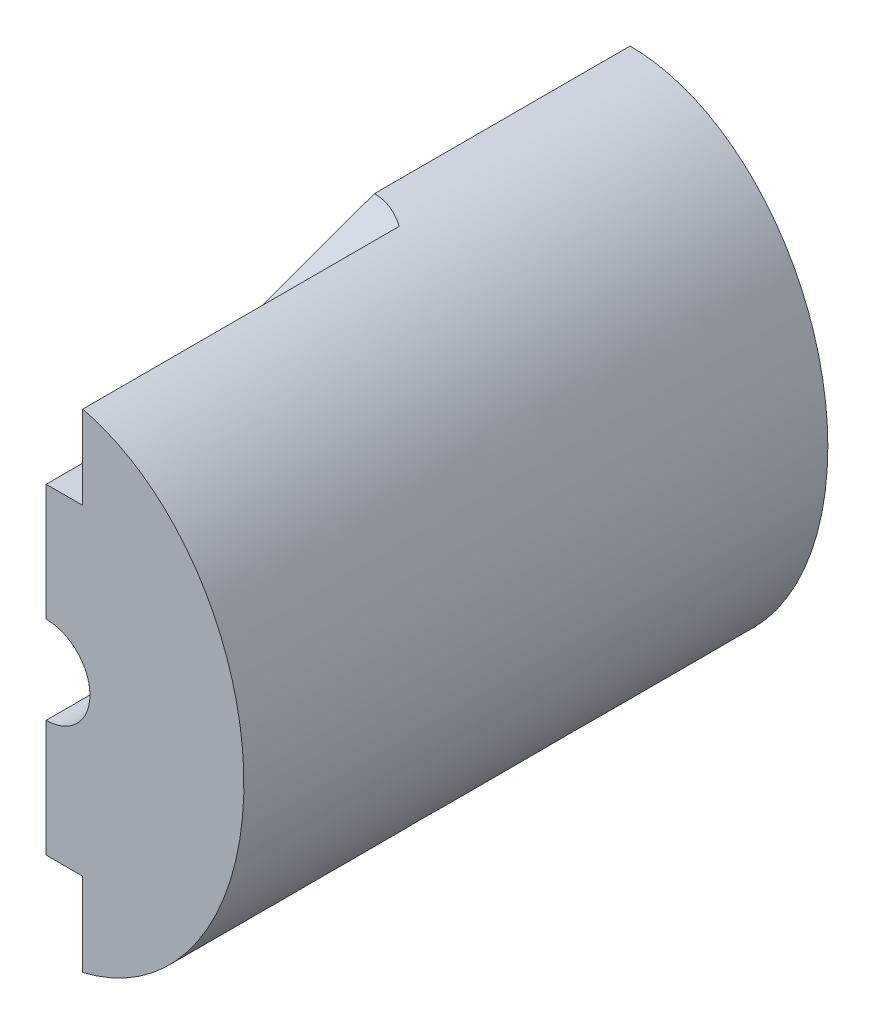
ISO-10303-21;
HEADER;
FILE_DESCRIPTION(('STEP AP214'),'2;1');
FILE_NAME('part.step','',(''),(''),'','','');
FILE_SCHEMA(('AUTOMOTIVE_DESIGN { 1 0 10303 214 1 1 1 1 }'));
ENDSEC;
DATA;
#1=APPLICATION_CONTEXT('core data for automotive mechanical design processes');
#2=APPLICATION_PROTOCOL_DEFINITION('international standard','automotive_design',2000,#1);
#3=PRODUCT_CONTEXT('',#1,'mechanical');
#4=PRODUCT('Part','Part','',(#3));
#5=PRODUCT_RELATED_PRODUCT_CATEGORY('part','',(#4));
#6=PRODUCT_DEFINITION_FORMATION('','',#4);
#7=PRODUCT_DEFINITION_CONTEXT('part definition',#1,'design');
#8=PRODUCT_DEFINITION('design','',#6,#7);
#9=PRODUCT_DEFINITION_SHAPE('','',#8);
#10=(LENGTH_UNIT() NAMED_UNIT(*) SI_UNIT(.MILLI.,.METRE.));
#11=(NAMED_UNIT(*) PLANE_ANGLE_UNIT() SI_UNIT($,.RADIAN.));
#12=(NAMED_UNIT(*) SI_UNIT($,.STERADIAN.) SOLID_ANGLE_UNIT());
#13=UNCERTAINTY_MEASURE_WITH_UNIT(LENGTH_MEASURE(1.E-05),#10,'distance_accuracy_value','');
#14=(GEOMETRIC_REPRESENTATION_CONTEXT(3) GLOBAL_UNCERTAINTY_ASSIGNED_CONTEXT((#13)) GLOBAL_UNIT_ASSIGNED_CONTEXT((#10,
#11,#12)) REPRESENTATION_CONTEXT('',''));
#15=CARTESIAN_POINT('',(0.,0.,0.));
#16=DIRECTION('',(0.,0.,1.));
#17=DIRECTION('',(1.,0.,0.));
#18=AXIS2_PLACEMENT_3D('',#15,#16,#17);
#19=CARTESIAN_POINT('',(-119.06755766464,97.1607366363261,200.));
#20=DIRECTION('',(0.,0.,1.));
#21=DIRECTION('',(0.,1.,0.));
#22=AXIS2_PLACEMENT_3D('',#19,#20,#21);
#23=ELLIPSE('',#22,85.,67.7310126304816);
#24=DIRECTION('',(0.,0.,-1.));
#25=VECTOR('',#24,1.);
#26=SURFACE_OF_LINEAR_EXTRUSION('',#23,#25);
#27=DIRECTION('',(0.,0.,-1.));
#28=VECTOR('',#27,1.);
#29=CARTESIAN_POINT('',(-119.06755766464,182.160736636326,200.));
#30=LINE('',#29,#28);
#31=CARTESIAN_POINT('',(-119.06755766464,182.160736636326,0.));
#32=VERTEX_POINT('',#31);
#33=CARTESIAN_POINT('',(-119.06755766464,182.160736636326,87.5756774163629));
#34=VERTEX_POINT('',#33);
#35=EDGE_CURVE('E240',#32,#34,#30,.F.);
#36=ORIENTED_EDGE('',*,*,#35,.T.);
#37=CARTESIAN_POINT('',(-119.06755766464,182.160736636326,87.5756774163624));
#38=CARTESIAN_POINT('',(-118.751528957889,182.160746298348,87.5756508701754));
#39=CARTESIAN_POINT('',(-118.43550840046,182.157961192985,87.5833028842719));
#40=CARTESIAN_POINT('',(-117.804729080292,182.146879203804,87.6137503993096));
#41=CARTESIAN_POINT('',(-117.489969179835,182.138589907137,87.6365250547248));
#42=CARTESIAN_POINT('',(-116.862309085146,182.116584856777,87.6969834337012));
#43=CARTESIAN_POINT('',(-116.54940771385,182.102873019261,87.7346563976581));
#44=CARTESIAN_POINT('',(-115.926042212752,182.070158881073,87.8245377536256));
#45=CARTESIAN_POINT('',(-115.615577643433,182.051157558095,87.8767434594473));
#46=CARTESIAN_POINT('',(-115.005200512825,182.008558170569,87.9937843147576));
#47=CARTESIAN_POINT('',(-114.705214588448,181.985082690343,88.058282666588));
#48=CARTESIAN_POINT('',(-114.108654095096,181.933444628746,88.200157074811));
#49=CARTESIAN_POINT('',(-113.812080216556,181.905281115974,88.277535690206));
#50=CARTESIAN_POINT('',(-113.222848846084,181.844482919395,88.4445773624492));
#51=CARTESIAN_POINT('',(-112.930191802661,181.811847728275,88.5342418131319));
#52=CARTESIAN_POINT('',(-112.349269876768,181.742346557089,88.7251947115907));
#53=CARTESIAN_POINT('',(-112.061004183658,181.705481368867,88.826480983793));
#54=CARTESIAN_POINT('',(-111.547431765945,181.635681916412,89.018253403304));
#55=CARTESIAN_POINT('',(-111.321271519189,181.603478632663,89.1067311982358));
#56=CARTESIAN_POINT('',(-110.872060374979,181.536670214636,89.2902858181952));
#57=CARTESIAN_POINT('',(-110.649008841605,181.502065580503,89.3853612690846));
#58=CARTESIAN_POINT('',(-110.206063772593,181.430571373016,89.581789989778));
#59=CARTESIAN_POINT('',(-109.986170222617,181.393681810039,89.6831432310686));
#60=CARTESIAN_POINT('',(-109.549585170998,181.317734412859,89.8918069898874));
#61=CARTESIAN_POINT('',(-109.332893967187,181.278676378564,89.9991180571608));
#62=CARTESIAN_POINT('',(-108.898424985661,181.197701426108,90.2215949105771));
#63=CARTESIAN_POINT('',(-108.680713950108,181.155742650341,90.336875699543));
#64=CARTESIAN_POINT('',(-108.248719432371,181.069815171474,90.572959507441));
#65=CARTESIAN_POINT('',(-108.034435868325,181.025846516475,90.6937623942162));
#66=CARTESIAN_POINT('',(-107.609344873645,180.936024715259,90.9405457648315));
#67=CARTESIAN_POINT('',(-107.39853664737,180.890172009012,91.0665250398653));
#68=CARTESIAN_POINT('',(-106.980440896421,180.79670641167,91.3233196580592));
#69=CARTESIAN_POINT('',(-106.773151564077,180.749094466853,91.4541324013389));
#70=CARTESIAN_POINT('',(-106.56755766464,180.700645429492,91.5872450374837));
#71=B_SPLINE_CURVE_WITH_KNOTS('',3,(#37,#38,#39,#40,#41,#42,#43,#44,#45,#46,#47,#48,#49,#50,#51,
#52,#53,#54,#55,#56,#57,#58,#59,#60,#61,#62,#63,#64,#65,#66,#67,#68,#69,#70),.UNSPECIFIED.,.F.,
.F.,(4,2,2,2,2,2,2,2,2,2,2,2,2,2,2,2,4),(0.,0.947968183888692,1.89463236363264,2.84061410450157,
3.78642110886951,4.70930268473401,5.63236783456578,6.55553779346336,7.47853521849686,
8.21334860418292,8.94800940204888,9.68266686336513,10.4173922266176,11.1669851057401,
11.9165600547173,12.6659609445031,13.4149644442028),.UNSPECIFIED.);
#72=CARTESIAN_POINT('',(-106.56755766464,180.700645429492,91.5872450374837));
#73=VERTEX_POINT('',#72);
#74=EDGE_CURVE('E62',#34,#73,#71,.T.);
#75=ORIENTED_EDGE('',*,*,#74,.T.);
#76=DIRECTION('',(0.,0.,1.));
#77=VECTOR('',#76,1.);
#78=CARTESIAN_POINT('',(-106.567557664639,180.700645429492,170.));
#79=LINE('',#78,#77);
#80=CARTESIAN_POINT('',(-106.567557664639,180.700645429492,200.));
#81=VERTEX_POINT('',#80);
#82=EDGE_CURVE('E142',#73,#81,#79,.T.);
#83=ORIENTED_EDGE('',*,*,#82,.T.);
#84=CARTESIAN_POINT('',(-106.567557664639,13.6208278431604,200.));
#85=VERTEX_POINT('',#84);
#86=EDGE_CURVE('E180',#85,#81,#23,.T.);
#87=ORIENTED_EDGE('',*,*,#86,.F.);
#88=DIRECTION('',(0.,0.,1.));
#89=VECTOR('',#88,1.);
#90=CARTESIAN_POINT('',(-106.567557664639,13.6208278431603,170.));
#91=LINE('',#90,#89);
#92=CARTESIAN_POINT('',(-106.56755766464,13.6208278431603,91.5872450374837));
#93=VERTEX_POINT('',#92);
#94=EDGE_CURVE('E247',#93,#85,#91,.T.);
#95=ORIENTED_EDGE('',*,*,#94,.F.);
#96=CARTESIAN_POINT('',(-106.56755766464,13.6208278431603,91.5872450374835));
#97=CARTESIAN_POINT('',(-106.828390593423,13.5593619657355,91.4183689271921));
#98=CARTESIAN_POINT('',(-107.091957967155,13.4992415099564,91.2531893324915));
#99=CARTESIAN_POINT('',(-107.62502792661,13.3818195242007,90.9305750780802));
#100=CARTESIAN_POINT('',(-107.89453970735,13.3245228804211,90.7731538430854));
#101=CARTESIAN_POINT('',(-108.439323397133,13.2130364897117,90.4668475020348));
#102=CARTESIAN_POINT('',(-108.714600009012,13.1588494259169,90.3179697678321));
#103=CARTESIAN_POINT('',(-109.270718338983,13.0538682081119,90.0295362424458));
#104=CARTESIAN_POINT('',(-109.551561293792,13.0030748193097,89.8899825536544));
#105=CARTESIAN_POINT('',(-110.111258766423,12.9064282621854,89.6244483202873));
#106=CARTESIAN_POINT('',(-110.389973846271,12.8604807508916,89.4982085705273));
#107=CARTESIAN_POINT('',(-110.952282054748,12.7723205623565,89.2559904432325));
#108=CARTESIAN_POINT('',(-111.235873179582,12.7301063927472,89.1400079654499));
#109=CARTESIAN_POINT('',(-111.807717126348,12.6496550753014,88.918969787402));
#110=CARTESIAN_POINT('',(-112.095968120002,12.6114164094492,88.8139099164231));
#111=CARTESIAN_POINT('',(-112.676912535089,12.539148068847,88.615354282477));
#112=CARTESIAN_POINT('',(-112.969605308912,12.5051177870115,88.5218568515564));
#113=CARTESIAN_POINT('',(-113.496265050533,12.448279093315,88.365693824074));
#114=CARTESIAN_POINT('',(-113.729453938174,12.4246247155582,88.300703955316));
#115=CARTESIAN_POINT('',(-114.198169524482,12.3801740368266,88.1785767192215));
#116=CARTESIAN_POINT('',(-114.433696360765,12.3593779051766,88.121439817101));
#117=CARTESIAN_POINT('',(-114.906804837377,12.3207494173898,88.0153089191592));
#118=CARTESIAN_POINT('',(-115.144386346293,12.3029168731614,87.9663144065603));
#119=CARTESIAN_POINT('',(-115.621315423644,12.2703074810839,87.876720838165));
#120=CARTESIAN_POINT('',(-115.860662831294,12.2555303585087,87.8361210275653));
#121=CARTESIAN_POINT('',(-116.345797272195,12.2288365077684,87.7627802754181));
#122=CARTESIAN_POINT('',(-116.591615150819,12.2169852182401,87.7302191250475));
#123=CARTESIAN_POINT('',(-117.084452570513,12.1966147953958,87.6742518482581));
#124=CARTESIAN_POINT('',(-117.331472219249,12.1880959664162,87.6508465579965));
#125=CARTESIAN_POINT('',(-117.826392149548,12.1744418631683,87.61333221764));
#126=CARTESIAN_POINT('',(-118.074292692008,12.1693076931455,87.5992262014347));
#127=CARTESIAN_POINT('',(-118.570647065746,12.1624521778466,87.5803908279521));
#128=CARTESIAN_POINT('',(-118.819101141418,12.1607329045147,87.575667163295));
#129=CARTESIAN_POINT('',(-119.06755766464,12.1607366363261,87.5756774163624));
#130=B_SPLINE_CURVE_WITH_KNOTS('',3,(#96,#97,#98,#99,#100,#101,#102,#103,#104,#105,#106,#107,
#108,#109,#110,#111,#112,#113,#114,#115,#116,#117,#118,#119,#120,#121,#122,#123,#124,#125,#126,
#127,#128,#129),.UNSPECIFIED.,.F.,.F.,(4,2,2,2,2,2,2,2,2,2,2,2,2,2,2,2,4),(0.,0.950245393800569,
1.90208113376269,2.85472619432076,3.80758533805184,4.73557311727292,5.66318824941297,
6.59044786778007,7.51757356680467,8.24711615077847,8.97670193483738,9.70624139617142,
10.435715232957,11.180267456805,11.9248876608763,12.6697506773446,13.4150654919237),.UNSPECIFIED.);
#131=CARTESIAN_POINT('',(-119.06755766464,12.160736636326,87.5756774163623));
#132=VERTEX_POINT('',#131);
#133=EDGE_CURVE('E144',#93,#132,#130,.T.);
#134=ORIENTED_EDGE('',*,*,#133,.T.);
#135=DIRECTION('',(0.,0.,-1.));
#136=VECTOR('',#135,1.);
#137=CARTESIAN_POINT('',(-119.06755766464,12.1607366363261,200.));
#138=LINE('',#137,#136);
#139=CARTESIAN_POINT('',(-119.06755766464,12.1607366363261,0.));
#140=VERTEX_POINT('',#139);
#141=EDGE_CURVE('E226',#132,#140,#138,.T.);
#142=ORIENTED_EDGE('',*,*,#141,.T.);
#143=CARTESIAN_POINT('',(-119.06755766464,97.1607366363261,0.));
#144=DIRECTION('',(0.,0.,1.));
#145=DIRECTION('',(0.,1.,0.));
#146=AXIS2_PLACEMENT_3D('',#143,#144,#145);
#147=ELLIPSE('',#146,85.,67.7310126304816);
#148=EDGE_CURVE('E178',#140,#32,#147,.T.);
#149=ORIENTED_EDGE('',*,*,#148,.T.);
#150=EDGE_LOOP('',(#36,#75,#83,#87,#95,#134,#142,#149));
#151=FACE_BOUND('',#150,.T.);
#152=ADVANCED_FACE('F45',(#151),#26,.F.);
#153=CARTESIAN_POINT('',(-119.06755766464,97.1607366363261,200.));
#154=DIRECTION('',(0.,0.,1.));
#155=DIRECTION('',(1.,0.,0.));
#156=AXIS2_PLACEMENT_3D('',#153,#154,#155);
#157=PLANE('',#156);
#158=CARTESIAN_POINT('',(-119.06755766464,97.1607366363261,200.));
#159=DIRECTION('',(0.,0.,1.));
#160=DIRECTION('',(1.,0.,0.));
#161=AXIS2_PLACEMENT_3D('',#158,#159,#160);
#162=CIRCLE('',#161,15.);
#163=CARTESIAN_POINT('',(-119.06755766464,82.1607366363261,200.));
#164=VERTEX_POINT('',#163);
#165=CARTESIAN_POINT('',(-119.06755766464,112.160736636326,200.));
#166=VERTEX_POINT('',#165);
#167=EDGE_CURVE('E210',#164,#166,#162,.T.);
#168=ORIENTED_EDGE('',*,*,#167,.F.);
#169=DIRECTION('',(0.,1.,0.));
#170=VECTOR('',#169,1.);
#171=CARTESIAN_POINT('',(-119.06755766464,202.20191082451,200.));
#172=LINE('',#171,#170);
#173=CARTESIAN_POINT('',(-119.06755766464,42.1607366363261,200.));
#174=VERTEX_POINT('',#173);
#175=EDGE_CURVE('E213',#174,#164,#172,.T.);
#176=ORIENTED_EDGE('',*,*,#175,.F.);
#177=DIRECTION('',(-1.,0.,0.));
#178=VECTOR('',#177,1.);
#179=CARTESIAN_POINT('',(-131.567557664639,42.1607366363261,200.));
#180=LINE('',#179,#178);
#181=CARTESIAN_POINT('',(-106.567557664639,42.1607366363261,200.));
#182=VERTEX_POINT('',#181);
#183=EDGE_CURVE('E248',#182,#174,#180,.T.);
#184=ORIENTED_EDGE('',*,*,#183,.F.);
#185=DIRECTION('',(0.,1.,0.));
#186=VECTOR('',#185,1.);
#187=CARTESIAN_POINT('',(-106.567557664639,42.1607366363261,200.));
#188=LINE('',#187,#186);
#189=EDGE_CURVE('E173',#85,#182,#188,.T.);
#190=ORIENTED_EDGE('',*,*,#189,.F.);
#191=ORIENTED_EDGE('',*,*,#86,.T.);
#192=DIRECTION('',(0.,1.,0.));
#193=VECTOR('',#192,1.);
#194=CARTESIAN_POINT('',(-106.567557664639,180.700645429492,200.));
#195=LINE('',#194,#193);
#196=CARTESIAN_POINT('',(-106.567557664639,152.160736636326,200.));
#197=VERTEX_POINT('',#196);
#198=EDGE_CURVE('E171',#197,#81,#195,.T.);
#199=ORIENTED_EDGE('',*,*,#198,.F.);
#200=DIRECTION('',(1.,0.,0.));
#201=VECTOR('',#200,1.);
#202=CARTESIAN_POINT('',(-131.567557664639,152.160736636326,200.));
#203=LINE('',#202,#201);
#204=CARTESIAN_POINT('',(-119.06755766464,152.160736636326,200.));
#205=VERTEX_POINT('',#204);
#206=EDGE_CURVE('E154',#205,#197,#203,.T.);
#207=ORIENTED_EDGE('',*,*,#206,.F.);
#208=EDGE_CURVE('E204',#166,#205,#172,.T.);
#209=ORIENTED_EDGE('',*,*,#208,.F.);
#210=EDGE_LOOP('',(#168,#176,#184,#190,#191,#199,#207,#209));
#211=FACE_BOUND('',#210,.T.);
#212=ADVANCED_FACE('F208',(#211),#157,.T.);
#213=CARTESIAN_POINT('',(-119.06755766464,97.1607366363261,0.));
#214=DIRECTION('',(0.,0.,1.));
#215=DIRECTION('',(1.,0.,0.));
#216=AXIS2_PLACEMENT_3D('',#213,#214,#215);
#217=PLANE('',#216);
#218=ORIENTED_EDGE('',*,*,#148,.F.);
#219=DIRECTION('',(0.,1.,0.));
#220=VECTOR('',#219,1.);
#221=CARTESIAN_POINT('',(-119.06755766464,97.1607366363261,0.));
#222=LINE('',#221,#220);
#223=CARTESIAN_POINT('',(-119.06755766464,89.6607366363261,0.));
#224=VERTEX_POINT('',#223);
#225=EDGE_CURVE('E229',#140,#224,#222,.T.);
#226=ORIENTED_EDGE('',*,*,#225,.T.);
#227=CARTESIAN_POINT('',(-119.06755766464,97.1607366363261,0.));
#228=DIRECTION('',(0.,0.,1.));
#229=DIRECTION('',(1.,0.,0.));
#230=AXIS2_PLACEMENT_3D('',#227,#228,#229);
#231=CIRCLE('',#230,7.50000000000001);
#232=CARTESIAN_POINT('',(-119.06755766464,104.660736636326,0.));
#233=VERTEX_POINT('',#232);
#234=EDGE_CURVE('E185',#233,#224,#231,.F.);
#235=ORIENTED_EDGE('',*,*,#234,.F.);
#236=EDGE_CURVE('E165',#233,#32,#222,.T.);
#237=ORIENTED_EDGE('',*,*,#236,.T.);
#238=EDGE_LOOP('',(#218,#226,#235,#237));
#239=FACE_BOUND('',#238,.T.);
#240=ADVANCED_FACE('F341',(#239),#217,.F.);
#241=CARTESIAN_POINT('',(-119.06755766464,97.1607366363261,-30.));
#242=DIRECTION('',(0.,0.,1.));
#243=DIRECTION('',(1.,0.,0.));
#244=AXIS2_PLACEMENT_3D('',#241,#242,#243);
#245=CYLINDRICAL_SURFACE('',#244,7.50000000000001);
#246=CARTESIAN_POINT('',(-119.06755766464,97.1607366363261,-30.));
#247=DIRECTION('',(0.,0.,-1.));
#248=DIRECTION('',(-1.,0.,0.));
#249=AXIS2_PLACEMENT_3D('',#246,#247,#248);
#250=CIRCLE('',#249,7.50000000000001);
#251=CARTESIAN_POINT('',(-119.06755766464,104.660736636326,-30.));
#252=VERTEX_POINT('',#251);
#253=CARTESIAN_POINT('',(-119.06755766464,89.6607366363261,-30.));
#254=VERTEX_POINT('',#253);
#255=EDGE_CURVE('E175',#252,#254,#250,.T.);
#256=ORIENTED_EDGE('',*,*,#255,.F.);
#257=DIRECTION('',(0.,0.,1.));
#258=VECTOR('',#257,1.);
#259=CARTESIAN_POINT('',(-119.06755766464,104.660736636326,-30.));
#260=LINE('',#259,#258);
#261=EDGE_CURVE('E159',#252,#233,#260,.T.);
#262=ORIENTED_EDGE('',*,*,#261,.T.);
#263=ORIENTED_EDGE('',*,*,#234,.T.);
#264=DIRECTION('',(0.,0.,1.));
#265=VECTOR('',#264,1.);
#266=CARTESIAN_POINT('',(-119.06755766464,89.6607366363261,-30.));
#267=LINE('',#266,#265);
#268=EDGE_CURVE('E233',#224,#254,#267,.F.);
#269=ORIENTED_EDGE('',*,*,#268,.T.);
#270=EDGE_LOOP('',(#256,#262,#263,#269));
#271=FACE_BOUND('',#270,.T.);
#272=ADVANCED_FACE('F337',(#271),#245,.T.);
#273=CARTESIAN_POINT('',(-119.06755766464,97.1607366363261,-30.));
#274=DIRECTION('',(0.,0.,-1.));
#275=DIRECTION('',(-1.,0.,0.));
#276=AXIS2_PLACEMENT_3D('',#273,#274,#275);
#277=PLANE('',#276);
#278=DIRECTION('',(0.,1.,0.));
#279=VECTOR('',#278,1.);
#280=CARTESIAN_POINT('',(-119.06755766464,202.20191082451,-30.));
#281=LINE('',#280,#279);
#282=EDGE_CURVE('E217',#254,#252,#281,.T.);
#283=ORIENTED_EDGE('',*,*,#282,.T.);
#284=ORIENTED_EDGE('',*,*,#255,.T.);
#285=EDGE_LOOP('',(#283,#284));
#286=FACE_BOUND('',#285,.T.);
#287=ADVANCED_FACE('F331',(#286),#277,.T.);
#288=CARTESIAN_POINT('',(-106.567557664639,180.700645429492,170.));
#289=DIRECTION('',(1.,0.,0.));
#290=DIRECTION('',(0.,0.,-1.));
#291=AXIS2_PLACEMENT_3D('',#288,#289,#290);
#292=PLANE('',#291);
#293=CARTESIAN_POINT('',(-106.567557664639,169.660736636326,185.));
#294=DIRECTION('',(-1.,0.,0.));
#295=DIRECTION('',(0.,0.,1.));
#296=AXIS2_PLACEMENT_3D('',#293,#294,#295);
#297=CIRCLE('',#296,7.50000000000001);
#298=CARTESIAN_POINT('',(-106.567557664639,169.660736636326,192.5));
#299=VERTEX_POINT('',#298);
#300=EDGE_CURVE('E481',#299,#299,#297,.T.);
#301=ORIENTED_EDGE('',*,*,#300,.F.);
#302=EDGE_LOOP('',(#301));
#303=FACE_BOUND('',#302,.T.);
#304=ORIENTED_EDGE('',*,*,#198,.T.);
#305=ORIENTED_EDGE('',*,*,#82,.F.);
#306=DIRECTION('',(0.,-0.342020143325673,0.939692620785907));
#307=VECTOR('',#306,1.);
#308=CARTESIAN_POINT('',(-106.56755766464,152.160736636326,170.));
#309=LINE('',#308,#307);
#310=CARTESIAN_POINT('',(-106.56755766464,152.160736636326,170.));
#311=VERTEX_POINT('',#310);
#312=EDGE_CURVE('E135',#73,#311,#309,.T.);
#313=ORIENTED_EDGE('',*,*,#312,.T.);
#314=DIRECTION('',(0.,0.,1.));
#315=VECTOR('',#314,1.);
#316=CARTESIAN_POINT('',(-106.567557664639,152.160736636326,170.));
#317=LINE('',#316,#315);
#318=EDGE_CURVE('E139',#311,#197,#317,.T.);
#319=ORIENTED_EDGE('',*,*,#318,.T.);
#320=EDGE_LOOP('',(#304,#305,#313,#319));
#321=FACE_BOUND('',#320,.T.);
#322=ADVANCED_FACE('F137',(#303,#321),#292,.F.);
#323=CARTESIAN_POINT('',(-131.567557664639,152.160736636326,170.));
#324=DIRECTION('',(0.,-1.,0.));
#325=DIRECTION('',(0.,0.,-1.));
#326=AXIS2_PLACEMENT_3D('',#323,#324,#325);
#327=PLANE('',#326);
#328=DIRECTION('',(1.,0.,0.));
#329=VECTOR('',#328,1.);
#330=CARTESIAN_POINT('',(-131.567557664639,152.160736636326,170.));
#331=LINE('',#330,#329);
#332=CARTESIAN_POINT('',(-119.06755766464,152.160736636326,170.));
#333=VERTEX_POINT('',#332);
#334=EDGE_CURVE('E148',#333,#311,#331,.T.);
#335=ORIENTED_EDGE('',*,*,#334,.F.);
#336=DIRECTION('',(0.,0.,1.));
#337=VECTOR('',#336,1.);
#338=CARTESIAN_POINT('',(-119.06755766464,152.160736636326,170.));
#339=LINE('',#338,#337);
#340=EDGE_CURVE('E237',#333,#205,#339,.T.);
#341=ORIENTED_EDGE('',*,*,#340,.T.);
#342=ORIENTED_EDGE('',*,*,#206,.T.);
#343=ORIENTED_EDGE('',*,*,#318,.F.);
#344=EDGE_LOOP('',(#335,#341,#342,#343));
#345=FACE_BOUND('',#344,.T.);
#346=ADVANCED_FACE('F156',(#345),#327,.F.);
#347=CARTESIAN_POINT('',(-131.567557664639,42.1607366363261,170.));
#348=DIRECTION('',(0.,1.,0.));
#349=DIRECTION('',(-1.,0.,0.));
#350=AXIS2_PLACEMENT_3D('',#347,#348,#349);
#351=PLANE('',#350);
#352=ORIENTED_EDGE('',*,*,#183,.T.);
#353=DIRECTION('',(0.,0.,-1.));
#354=VECTOR('',#353,1.);
#355=CARTESIAN_POINT('',(-119.06755766464,42.1607366363261,170.));
#356=LINE('',#355,#354);
#357=CARTESIAN_POINT('',(-119.06755766464,42.1607366363261,170.));
#358=VERTEX_POINT('',#357);
#359=EDGE_CURVE('E222',#174,#358,#356,.T.);
#360=ORIENTED_EDGE('',*,*,#359,.T.);
#361=DIRECTION('',(-1.,0.,0.));
#362=VECTOR('',#361,1.);
#363=CARTESIAN_POINT('',(-131.567557664639,42.1607366363261,170.));
#364=LINE('',#363,#362);
#365=CARTESIAN_POINT('',(-106.56755766464,42.1607366363261,170.));
#366=VERTEX_POINT('',#365);
#367=EDGE_CURVE('E244',#366,#358,#364,.T.);
#368=ORIENTED_EDGE('',*,*,#367,.F.);
#369=DIRECTION('',(0.,0.,1.));
#370=VECTOR('',#369,1.);
#371=CARTESIAN_POINT('',(-106.567557664639,42.1607366363261,170.));
#372=LINE('',#371,#370);
#373=EDGE_CURVE('E179',#366,#182,#372,.T.);
#374=ORIENTED_EDGE('',*,*,#373,.T.);
#375=EDGE_LOOP('',(#352,#360,#368,#374));
#376=FACE_BOUND('',#375,.T.);
#377=ADVANCED_FACE('F322',(#376),#351,.F.);
#378=CARTESIAN_POINT('',(-106.567557664639,42.1607366363261,170.));
#379=DIRECTION('',(1.,0.,0.));
#380=DIRECTION('',(0.,1.,0.));
#381=AXIS2_PLACEMENT_3D('',#378,#379,#380);
#382=PLANE('',#381);
#383=CARTESIAN_POINT('',(-106.567557664639,24.6607366363261,185.));
#384=DIRECTION('',(-1.,0.,0.));
#385=DIRECTION('',(0.,0.,1.));
#386=AXIS2_PLACEMENT_3D('',#383,#384,#385);
#387=CIRCLE('',#386,7.50000000000001);
#388=CARTESIAN_POINT('',(-106.567557664639,24.6607366363261,192.5));
#389=VERTEX_POINT('',#388);
#390=EDGE_CURVE('E274',#389,#389,#387,.T.);
#391=ORIENTED_EDGE('',*,*,#390,.F.);
#392=EDGE_LOOP('',(#391));
#393=FACE_BOUND('',#392,.T.);
#394=ORIENTED_EDGE('',*,*,#189,.T.);
#395=ORIENTED_EDGE('',*,*,#373,.F.);
#396=DIRECTION('',(0.,-0.342020143325673,-0.939692620785907));
#397=VECTOR('',#396,1.);
#398=CARTESIAN_POINT('',(-106.56755766464,42.1607366363261,170.));
#399=LINE('',#398,#397);
#400=EDGE_CURVE('E263',#366,#93,#399,.T.);
#401=ORIENTED_EDGE('',*,*,#400,.T.);
#402=ORIENTED_EDGE('',*,*,#94,.T.);
#403=EDGE_LOOP('',(#394,#395,#401,#402));
#404=FACE_BOUND('',#403,.T.);
#405=ADVANCED_FACE('F260',(#393,#404),#382,.F.);
#406=CARTESIAN_POINT('',(-119.06755766464,202.20191082451,-30.));
#407=DIRECTION('',(1.,0.,0.));
#408=DIRECTION('',(0.,0.,-1.));
#409=AXIS2_PLACEMENT_3D('',#406,#407,#408);
#410=PLANE('',#409);
#411=ORIENTED_EDGE('',*,*,#340,.F.);
#412=DIRECTION('',(0.,0.342020143325673,-0.939692620785907));
#413=VECTOR('',#412,1.);
#414=CARTESIAN_POINT('',(-119.06755766464,222.293202992069,-22.6873676830627));
#415=LINE('',#414,#413);
#416=EDGE_CURVE('E11',#333,#34,#415,.T.);
#417=ORIENTED_EDGE('',*,*,#416,.T.);
#418=ORIENTED_EDGE('',*,*,#35,.F.);
#419=ORIENTED_EDGE('',*,*,#236,.F.);
#420=ORIENTED_EDGE('',*,*,#261,.F.);
#421=ORIENTED_EDGE('',*,*,#282,.F.);
#422=ORIENTED_EDGE('',*,*,#268,.F.);
#423=ORIENTED_EDGE('',*,*,#225,.F.);
#424=ORIENTED_EDGE('',*,*,#141,.F.);
#425=DIRECTION('',(0.,-0.342020143325673,-0.939692620785907));
#426=VECTOR('',#425,1.);
#427=CARTESIAN_POINT('',(-119.06755766464,42.1607366363261,170.));
#428=LINE('',#427,#426);
#429=EDGE_CURVE('E145',#358,#132,#428,.T.);
#430=ORIENTED_EDGE('',*,*,#429,.F.);
#431=ORIENTED_EDGE('',*,*,#359,.F.);
#432=ORIENTED_EDGE('',*,*,#175,.T.);
#433=DIRECTION('',(0.,0.,1.));
#434=VECTOR('',#433,1.);
#435=CARTESIAN_POINT('',(-119.06755766464,82.1607366363261,180.));
#436=LINE('',#435,#434);
#437=CARTESIAN_POINT('',(-119.06755766464,82.1607366363261,180.));
#438=VERTEX_POINT('',#437);
#439=EDGE_CURVE('E195',#164,#438,#436,.F.);
#440=ORIENTED_EDGE('',*,*,#439,.T.);
#441=DIRECTION('',(0.,-1.,0.));
#442=VECTOR('',#441,1.);
#443=CARTESIAN_POINT('',(-119.06755766464,202.20191082451,180.));
#444=LINE('',#443,#442);
#445=CARTESIAN_POINT('',(-119.06755766464,112.160736636326,180.));
#446=VERTEX_POINT('',#445);
#447=EDGE_CURVE('E192',#446,#438,#444,.T.);
#448=ORIENTED_EDGE('',*,*,#447,.F.);
#449=DIRECTION('',(0.,0.,1.));
#450=VECTOR('',#449,1.);
#451=CARTESIAN_POINT('',(-119.06755766464,112.160736636326,180.));
#452=LINE('',#451,#450);
#453=EDGE_CURVE('E55',#446,#166,#452,.T.);
#454=ORIENTED_EDGE('',*,*,#453,.T.);
#455=ORIENTED_EDGE('',*,*,#208,.T.);
#456=EDGE_LOOP('',(#411,#417,#418,#419,#420,#421,#422,#423,#424,#430,#431,#432,#440,#448,#454,#455));
#457=FACE_BOUND('',#456,.T.);
#458=ADVANCED_FACE('F203',(#457),#410,.F.);
#459=CARTESIAN_POINT('',(-119.06755766464,97.1607366363261,180.));
#460=DIRECTION('',(0.,0.,1.));
#461=DIRECTION('',(1.,0.,0.));
#462=AXIS2_PLACEMENT_3D('',#459,#460,#461);
#463=CYLINDRICAL_SURFACE('',#462,15.);
#464=CARTESIAN_POINT('',(-119.06755766464,97.1607366363261,180.));
#465=DIRECTION('',(0.,0.,1.));
#466=DIRECTION('',(1.,0.,0.));
#467=AXIS2_PLACEMENT_3D('',#464,#465,#466);
#468=CIRCLE('',#467,15.);
#469=EDGE_CURVE('E68',#438,#446,#468,.T.);
#470=ORIENTED_EDGE('',*,*,#469,.F.);
#471=ORIENTED_EDGE('',*,*,#439,.F.);
#472=ORIENTED_EDGE('',*,*,#167,.T.);
#473=ORIENTED_EDGE('',*,*,#453,.F.);
#474=EDGE_LOOP('',(#470,#471,#472,#473));
#475=FACE_BOUND('',#474,.T.);
#476=ADVANCED_FACE('F317',(#475),#463,.F.);
#477=CARTESIAN_POINT('',(-119.06755766464,97.1607366363261,180.));
#478=DIRECTION('',(0.,0.,1.));
#479=DIRECTION('',(1.,0.,0.));
#480=AXIS2_PLACEMENT_3D('',#477,#478,#479);
#481=PLANE('',#480);
#482=ORIENTED_EDGE('',*,*,#447,.T.);
#483=ORIENTED_EDGE('',*,*,#469,.T.);
#484=EDGE_LOOP('',(#482,#483));
#485=FACE_BOUND('',#484,.T.);
#486=ADVANCED_FACE('F310',(#485),#481,.T.);
#487=CARTESIAN_POINT('',(-98.5675576646393,24.6607366363261,185.));
#488=DIRECTION('',(-1.,0.,0.));
#489=DIRECTION('',(0.,0.,1.));
#490=AXIS2_PLACEMENT_3D('',#487,#488,#489);
#491=CYLINDRICAL_SURFACE('',#490,7.50000000000001);
#492=CARTESIAN_POINT('',(-98.5675576646393,24.6607366363261,185.));
#493=DIRECTION('',(-1.,0.,0.));
#494=DIRECTION('',(0.,0.,1.));
#495=AXIS2_PLACEMENT_3D('',#492,#493,#494);
#496=CIRCLE('',#495,7.50000000000001);
#497=CARTESIAN_POINT('',(-98.5675576646393,24.6607366363261,192.5));
#498=VERTEX_POINT('',#497);
#499=EDGE_CURVE('E269',#498,#498,#496,.T.);
#500=ORIENTED_EDGE('',*,*,#499,.F.);
#501=EDGE_LOOP('',(#500));
#502=FACE_BOUND('',#501,.T.);
#503=ORIENTED_EDGE('',*,*,#390,.T.);
#504=EDGE_LOOP('',(#503));
#505=FACE_BOUND('',#504,.T.);
#506=ADVANCED_FACE('F307',(#502,#505),#491,.F.);
#507=CARTESIAN_POINT('',(-98.5675576646393,24.6607366363261,185.));
#508=DIRECTION('',(-1.,0.,0.));
#509=DIRECTION('',(0.,0.,1.));
#510=AXIS2_PLACEMENT_3D('',#507,#508,#509);
#511=PLANE('',#510);
#512=ORIENTED_EDGE('',*,*,#499,.T.);
#513=EDGE_LOOP('',(#512));
#514=FACE_BOUND('',#513,.T.);
#515=ADVANCED_FACE('F305',(#514),#511,.T.);
#516=CARTESIAN_POINT('',(-98.5675576646393,169.660736636326,185.));
#517=DIRECTION('',(-1.,0.,0.));
#518=DIRECTION('',(0.,0.,1.));
#519=AXIS2_PLACEMENT_3D('',#516,#517,#518);
#520=CYLINDRICAL_SURFACE('',#519,7.50000000000001);
#521=CARTESIAN_POINT('',(-98.5675576646393,169.660736636326,185.));
#522=DIRECTION('',(-1.,0.,0.));
#523=DIRECTION('',(0.,0.,1.));
#524=AXIS2_PLACEMENT_3D('',#521,#522,#523);
#525=CIRCLE('',#524,7.50000000000001);
#526=CARTESIAN_POINT('',(-98.5675576646393,169.660736636326,192.5));
#527=VERTEX_POINT('',#526);
#528=EDGE_CURVE('E289',#527,#527,#525,.T.);
#529=ORIENTED_EDGE('',*,*,#528,.F.);
#530=EDGE_LOOP('',(#529));
#531=FACE_BOUND('',#530,.T.);
#532=ORIENTED_EDGE('',*,*,#300,.T.);
#533=EDGE_LOOP('',(#532));
#534=FACE_BOUND('',#533,.T.);
#535=ADVANCED_FACE('F301',(#531,#534),#520,.F.);
#536=CARTESIAN_POINT('',(-98.5675576646393,169.660736636326,185.));
#537=DIRECTION('',(-1.,0.,0.));
#538=DIRECTION('',(0.,0.,1.));
#539=AXIS2_PLACEMENT_3D('',#536,#537,#538);
#540=PLANE('',#539);
#541=ORIENTED_EDGE('',*,*,#528,.T.);
#542=EDGE_LOOP('',(#541));
#543=FACE_BOUND('',#542,.T.);
#544=ADVANCED_FACE('F297',(#543),#540,.T.);
#545=CARTESIAN_POINT('',(-106.56755766464,42.1607366363261,170.));
#546=DIRECTION('',(0.,0.939692620785907,-0.342020143325673));
#547=DIRECTION('',(0.,0.342020143325673,0.939692620785907));
#548=AXIS2_PLACEMENT_3D('',#545,#546,#547);
#549=PLANE('',#548);
#550=ORIENTED_EDGE('',*,*,#400,.F.);
#551=ORIENTED_EDGE('',*,*,#367,.T.);
#552=ORIENTED_EDGE('',*,*,#429,.T.);
#553=ORIENTED_EDGE('',*,*,#133,.F.);
#554=EDGE_LOOP('',(#550,#551,#552,#553));
#555=FACE_BOUND('',#554,.T.);
#556=ADVANCED_FACE('F293',(#555),#549,.F.);
#557=CARTESIAN_POINT('',(-106.56755766464,152.160736636326,170.));
#558=DIRECTION('',(0.,-0.939692620785907,-0.342020143325673));
#559=DIRECTION('',(0.,0.342020143325673,-0.939692620785907));
#560=AXIS2_PLACEMENT_3D('',#557,#558,#559);
#561=PLANE('',#560);
#562=ORIENTED_EDGE('',*,*,#416,.F.);
#563=ORIENTED_EDGE('',*,*,#334,.T.);
#564=ORIENTED_EDGE('',*,*,#312,.F.);
#565=ORIENTED_EDGE('',*,*,#74,.F.);
#566=EDGE_LOOP('',(#562,#563,#564,#565));
#567=FACE_BOUND('',#566,.T.);
#568=ADVANCED_FACE('F149',(#567),#561,.F.);
#569=CLOSED_SHELL('',(#152,#212,#240,#272,#287,#322,#346,#377,#405,#458,#476,#486,#506,#515,
#535,#544,#556,#568));
#570=MANIFOLD_SOLID_BREP('B2',#569);
#571=ADVANCED_BREP_SHAPE_REPRESENTATION('',(#18,#570),#14);
#572=SHAPE_DEFINITION_REPRESENTATION(#9,#571);
ENDSEC;
END-ISO-10303-21;
